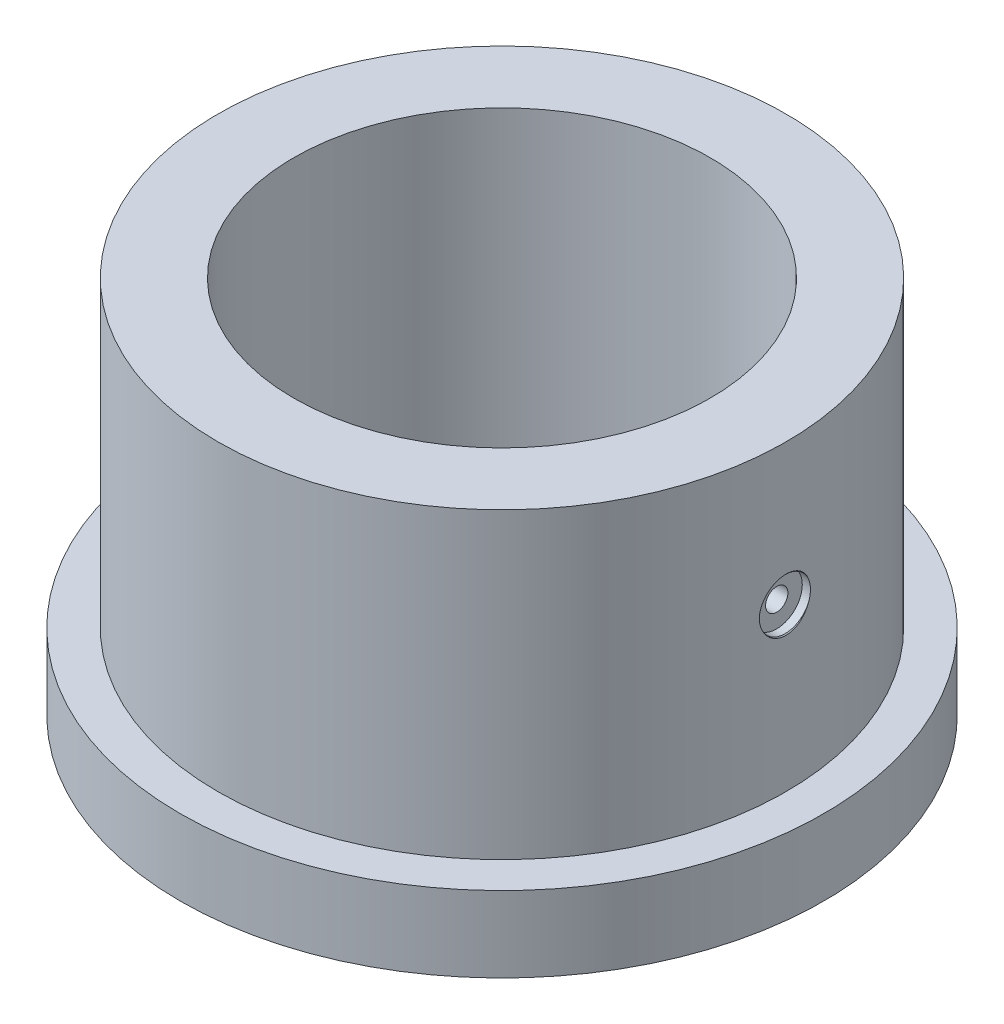
ISO-10303-21;
HEADER;
FILE_DESCRIPTION(('STEP AP214'),'2;1');
FILE_NAME('part.step','',(''),(''),'','','');
FILE_SCHEMA(('AUTOMOTIVE_DESIGN { 1 0 10303 214 1 1 1 1 }'));
ENDSEC;
DATA;
#1=APPLICATION_CONTEXT('core data for automotive mechanical design processes');
#2=APPLICATION_PROTOCOL_DEFINITION('international standard','automotive_design',2000,#1);
#3=PRODUCT_CONTEXT('',#1,'mechanical');
#4=PRODUCT('Part','Part','',(#3));
#5=PRODUCT_RELATED_PRODUCT_CATEGORY('part','',(#4));
#6=PRODUCT_DEFINITION_FORMATION('','',#4);
#7=PRODUCT_DEFINITION_CONTEXT('part definition',#1,'design');
#8=PRODUCT_DEFINITION('design','',#6,#7);
#9=PRODUCT_DEFINITION_SHAPE('','',#8);
#10=(LENGTH_UNIT() NAMED_UNIT(*) SI_UNIT(.MILLI.,.METRE.));
#11=(NAMED_UNIT(*) PLANE_ANGLE_UNIT() SI_UNIT($,.RADIAN.));
#12=(NAMED_UNIT(*) SI_UNIT($,.STERADIAN.) SOLID_ANGLE_UNIT());
#13=UNCERTAINTY_MEASURE_WITH_UNIT(LENGTH_MEASURE(1.E-05),#10,'distance_accuracy_value','');
#14=(GEOMETRIC_REPRESENTATION_CONTEXT(3) GLOBAL_UNCERTAINTY_ASSIGNED_CONTEXT((#13)) GLOBAL_UNIT_ASSIGNED_CONTEXT((#10,
#11,#12)) REPRESENTATION_CONTEXT('',''));
#15=CARTESIAN_POINT('',(0.,0.,0.));
#16=DIRECTION('',(0.,0.,1.));
#17=DIRECTION('',(1.,0.,0.));
#18=AXIS2_PLACEMENT_3D('',#15,#16,#17);
#19=CARTESIAN_POINT('',(0.,40.,0.));
#20=DIRECTION('',(0.,-1.,0.));
#21=DIRECTION('',(0.,0.,-1.));
#22=AXIS2_PLACEMENT_3D('',#19,#20,#21);
#23=CYLINDRICAL_SURFACE('',#22,37.5);
#24=CARTESIAN_POINT('',(37.3759872379215,19.9362053948256,3.04722463739168));
#25=CARTESIAN_POINT('',(37.3726797256802,20.0215978545941,3.08777002288828));
#26=CARTESIAN_POINT('',(37.3696033437569,20.108706355392,3.1247112210314));
#27=CARTESIAN_POINT('',(37.3639885897785,20.2857293180738,3.19116058974523));
#28=CARTESIAN_POINT('',(37.3614502106035,20.3756437428055,3.22066885868546));
#29=CARTESIAN_POINT('',(37.3569882165124,20.5576100002171,3.2720161805453));
#30=CARTESIAN_POINT('',(37.3550643000772,20.6496607607286,3.29385899545279));
#31=CARTESIAN_POINT('',(37.3518825815497,20.8352542157296,3.329741810013));
#32=CARTESIAN_POINT('',(37.3506247545447,20.928796854286,3.34378210149221));
#33=CARTESIAN_POINT('',(37.3479105475352,21.2108373126497,3.37403261802099));
#34=CARTESIAN_POINT('',(37.3475132070472,21.4007569982064,3.37837510730142));
#35=CARTESIAN_POINT('',(37.3496047828837,21.7784038527739,3.35516512404587));
#36=CARTESIAN_POINT('',(37.3520909126383,21.9661329617823,3.32764344491484));
#37=CARTESIAN_POINT('',(37.3582738755683,22.267192361125,3.25731457068637));
#38=CARTESIAN_POINT('',(37.361202029245,22.3827596828898,3.22370122485717));
#39=CARTESIAN_POINT('',(37.3679571317951,22.6095273088068,3.14440455619457));
#40=CARTESIAN_POINT('',(37.3717832354287,22.7207316056754,3.09873257912201));
#41=CARTESIAN_POINT('',(37.3759872379215,22.8292042152008,3.04722463739168));
#42=B_SPLINE_CURVE_WITH_KNOTS('',3,(#24,#25,#26,#27,#28,#29,#30,#31,#32,#33,#34,#35,#36,#37,#38,
#39,#40,#41),.UNSPECIFIED.,.F.,.F.,(4,2,2,2,2,2,2,2,4),(0.,0.283671136964744,0.567338519547046,
0.850866490876159,1.13438385710443,1.70138989622664,2.26784844003115,2.62838224538641,
2.98857803204161),.UNSPECIFIED.);
#43=CARTESIAN_POINT('',(37.3759872379215,19.9362053948256,3.04722463739167));
#44=VERTEX_POINT('',#43);
#45=CARTESIAN_POINT('',(37.3759872379215,22.8292042152008,3.04722463739168));
#46=VERTEX_POINT('',#45);
#47=EDGE_CURVE('E48',#44,#46,#42,.T.);
#48=ORIENTED_EDGE('',*,*,#47,.T.);
#49=CARTESIAN_POINT('',(37.3633859617138,22.4143081356666,3.19802899861885));
#50=CARTESIAN_POINT('',(37.365390995044,22.4936095597051,3.17459325336234));
#51=CARTESIAN_POINT('',(37.3676079679503,22.5720811131479,3.14844353211102));
#52=CARTESIAN_POINT('',(37.3724196410904,22.727021037142,3.09080906731293));
#53=CARTESIAN_POINT('',(37.3750143132335,22.803489556166,3.05932472048848));
#54=CARTESIAN_POINT('',(37.3833039455929,23.0296053635383,2.95690709088255));
#55=CARTESIAN_POINT('',(37.3894986098886,23.1757373727926,2.87807579593857));
#56=CARTESIAN_POINT('',(37.4041411249187,23.4851876814321,2.68176309295213));
#57=CARTESIAN_POINT('',(37.4127880966511,23.6455648286063,2.55962889714193));
#58=CARTESIAN_POINT('',(37.4302979095125,23.9425866225883,2.2893377061694));
#59=CARTESIAN_POINT('',(37.4391606779101,24.0792391425997,2.14118937695558));
#60=CARTESIAN_POINT('',(37.4557284365573,24.3199576213481,1.8281449727772));
#61=CARTESIAN_POINT('',(37.4634620451774,24.4249527268776,1.66396584245706));
#62=CARTESIAN_POINT('',(37.4771700708145,24.6044197253916,1.319598819364));
#63=CARTESIAN_POINT('',(37.4831447996911,24.6788970302792,1.13941377191774));
#64=CARTESIAN_POINT('',(37.4923687762712,24.791759972022,0.776945956685423));
#65=CARTESIAN_POINT('',(37.4957289963906,24.8316246212323,0.595126024080255));
#66=CARTESIAN_POINT('',(37.499761374976,24.8793030806965,0.227323963771679));
#67=CARTESIAN_POINT('',(37.5004342731599,24.8871257109185,0.0413429956199996));
#68=CARTESIAN_POINT('',(37.4990351551324,24.8706881410918,-0.323504494827572));
#69=CARTESIAN_POINT('',(37.497045735245,24.847393373875,-0.502415771125627));
#70=CARTESIAN_POINT('',(37.4906913288622,24.7712675994241,-0.853788494309411));
#71=CARTESIAN_POINT('',(37.4863262660142,24.7184356428679,-1.02624973370155));
#72=CARTESIAN_POINT('',(37.4756855444454,24.584899792982,-1.36054431054275));
#73=CARTESIAN_POINT('',(37.4694040388719,24.5041105022414,-1.52234325551148));
#74=CARTESIAN_POINT('',(37.4556091717827,24.317386531163,-1.83062489097532));
#75=CARTESIAN_POINT('',(37.4480957276161,24.2114501634901,-1.97710655275074));
#76=CARTESIAN_POINT('',(37.4323538747704,23.9737898059196,-2.25589363654875));
#77=CARTESIAN_POINT('',(37.4241100108507,23.8413264310076,-2.38756694531148));
#78=CARTESIAN_POINT('',(37.4079993263813,23.556927548946,-2.62795021139202));
#79=CARTESIAN_POINT('',(37.4001325874566,23.404987852254,-2.73665521464538));
#80=CARTESIAN_POINT('',(37.3869260211993,23.1153865091547,-2.91101262716051));
#81=CARTESIAN_POINT('',(37.3813877428516,22.980260225785,-2.98090772511597));
#82=CARTESIAN_POINT('',(37.3714512730723,22.7024366720605,-3.10292821633644));
#83=CARTESIAN_POINT('',(37.3670511918718,22.5597524311885,-3.1550831099275));
#84=CARTESIAN_POINT('',(37.3633859617138,22.4143081356666,-3.19802899861885));
#85=B_SPLINE_CURVE_WITH_KNOTS('',3,(#49,#50,#51,#52,#53,#54,#55,#56,#57,#58,#59,#60,#61,#62,#63,
#64,#65,#66,#67,#68,#69,#70,#71,#72,#73,#74,#75,#76,#77,#78,#79,#80,#81,#82,#83,#84),
.UNSPECIFIED.,.F.,.F.,(4,2,2,2,2,2,2,2,2,2,2,2,2,2,2,2,2,4),(0.,0.248055792045143,
0.496093144911716,0.992867325162136,1.59514478541185,2.19722199151993,2.77936406081942,
3.36140285067571,3.91713687579763,4.47271791786823,5.01145597887131,5.55021135585464,
6.09062713657916,6.63107918873403,7.1894743429262,7.74798981544084,8.20349129330153,
8.65823156810017),.UNSPECIFIED.);
#86=CARTESIAN_POINT('',(37.3759872379215,22.8292042152008,-3.04722463739168));
#87=VERTEX_POINT('',#86);
#88=EDGE_CURVE('E11',#46,#87,#85,.T.);
#89=ORIENTED_EDGE('',*,*,#88,.T.);
#90=CARTESIAN_POINT('',(37.3759872379215,22.8292042152008,-3.04722463739168));
#91=CARTESIAN_POINT('',(37.3726797256802,22.7438117554323,-3.08777002288828));
#92=CARTESIAN_POINT('',(37.3696033437569,22.6567032546343,-3.1247112210314));
#93=CARTESIAN_POINT('',(37.3639885897785,22.4796802919526,-3.19116058974523));
#94=CARTESIAN_POINT('',(37.3614502106035,22.3897658672208,-3.22066885868546));
#95=CARTESIAN_POINT('',(37.3569882165124,22.2077996098093,-3.2720161805453));
#96=CARTESIAN_POINT('',(37.3550643000772,22.1157488492978,-3.29385899545279));
#97=CARTESIAN_POINT('',(37.3518825815497,21.9301553942968,-3.329741810013));
#98=CARTESIAN_POINT('',(37.3506247545447,21.8366127557404,-3.34378210149221));
#99=CARTESIAN_POINT('',(37.3479105475352,21.5545722973767,-3.37403261802099));
#100=CARTESIAN_POINT('',(37.3475132070472,21.36465261182,-3.37837510730142));
#101=CARTESIAN_POINT('',(37.3496047828837,20.9870057572524,-3.35516512404587));
#102=CARTESIAN_POINT('',(37.3520909126383,20.799276648244,-3.32764344491484));
#103=CARTESIAN_POINT('',(37.3582738755683,20.4982172489014,-3.25731457068637));
#104=CARTESIAN_POINT('',(37.361202029245,20.3826499271366,-3.22370122485717));
#105=CARTESIAN_POINT('',(37.3679571317951,20.1558823012196,-3.14440455619457));
#106=CARTESIAN_POINT('',(37.3717832354287,20.044678004351,-3.09873257912201));
#107=CARTESIAN_POINT('',(37.3759872379215,19.9362053948256,-3.04722463739168));
#108=B_SPLINE_CURVE_WITH_KNOTS('',3,(#90,#91,#92,#93,#94,#95,#96,#97,#98,#99,#100,#101,#102,
#103,#104,#105,#106,#107),.UNSPECIFIED.,.F.,.F.,(4,2,2,2,2,2,2,2,4),(0.,0.283671136964747,
0.567338519547046,0.850866490876159,1.13438385710443,1.70138989622664,2.26784844003115,
2.62838224538641,2.98857803204161),.UNSPECIFIED.);
#109=CARTESIAN_POINT('',(37.3759872379215,19.9362053948256,-3.04722463739168));
#110=VERTEX_POINT('',#109);
#111=EDGE_CURVE('E67',#87,#110,#108,.T.);
#112=ORIENTED_EDGE('',*,*,#111,.T.);
#113=CARTESIAN_POINT('',(37.3633859617137,20.3511014743649,-3.19802899862035));
#114=CARTESIAN_POINT('',(37.3653909950438,20.2718000503263,-3.17459325336396));
#115=CARTESIAN_POINT('',(37.3676079679502,20.1933284968835,-3.14844353211276));
#116=CARTESIAN_POINT('',(37.3724196410902,20.0383885728893,-3.09080906731489));
#117=CARTESIAN_POINT('',(37.3750143132334,19.9619200538653,-3.05932472049056));
#118=CARTESIAN_POINT('',(37.3833039455927,19.7358042464928,-2.95690709088497));
#119=CARTESIAN_POINT('',(37.3894986098884,19.5896722372384,-2.87807579594121));
#120=CARTESIAN_POINT('',(37.4041411249185,19.2802219285986,-2.68176309295523));
#121=CARTESIAN_POINT('',(37.4127880966509,19.1198447814242,-2.55962889714526));
#122=CARTESIAN_POINT('',(37.4302979095123,18.8228229874417,-2.28933770617315));
#123=CARTESIAN_POINT('',(37.4391606779099,18.6861704674301,-2.14118937695953));
#124=CARTESIAN_POINT('',(37.455728436557,18.4454519886812,-1.82814497278147));
#125=CARTESIAN_POINT('',(37.4634620451773,18.3404568831514,-1.66396584246146));
#126=CARTESIAN_POINT('',(37.4771700708144,18.1609898846368,-1.31959881936862));
#127=CARTESIAN_POINT('',(37.4831447996909,18.0865125797489,-1.13941377192243));
#128=CARTESIAN_POINT('',(37.4923687762711,17.9736496380055,-0.776945956690213));
#129=CARTESIAN_POINT('',(37.4957289963905,17.933784988795,-0.595126024085072));
#130=CARTESIAN_POINT('',(37.499761374976,17.8861065293302,-0.227323963776499));
#131=CARTESIAN_POINT('',(37.5004342731599,17.878283899108,-0.0413429956247967));
#132=CARTESIAN_POINT('',(37.4990351551324,17.8947214689341,0.323504494822846));
#133=CARTESIAN_POINT('',(37.497045735245,17.9180162361507,0.502415771120948));
#134=CARTESIAN_POINT('',(37.4906913288623,17.994142010601,0.853788494304868));
#135=CARTESIAN_POINT('',(37.4863262660143,18.0469739671569,1.02624973369709));
#136=CARTESIAN_POINT('',(37.4756855444456,18.1805098170424,1.36054431053848));
#137=CARTESIAN_POINT('',(37.4694040388721,18.2612991077827,1.52234325550732));
#138=CARTESIAN_POINT('',(37.4556091717829,18.4480230788607,1.83062489097139));
#139=CARTESIAN_POINT('',(37.4480957276163,18.5539594465334,1.97710655274696));
#140=CARTESIAN_POINT('',(37.4323538747707,18.7916198041035,2.25589363654526));
#141=CARTESIAN_POINT('',(37.4241100108509,18.9240831790152,2.38756694530816));
#142=CARTESIAN_POINT('',(37.4079993263815,19.2084820610764,2.62795021138905));
#143=CARTESIAN_POINT('',(37.4001325874569,19.3604217577682,2.73665521464261));
#144=CARTESIAN_POINT('',(37.3869260211994,19.6500231008688,2.91101262715901));
#145=CARTESIAN_POINT('',(37.3813877428517,19.78514938424,2.98090772511535));
#146=CARTESIAN_POINT('',(37.3714512730723,20.0629729379676,3.10292821633719));
#147=CARTESIAN_POINT('',(37.3670511918717,20.2056571788413,3.15508310992873));
#148=CARTESIAN_POINT('',(37.3633859617137,20.3511014743649,3.19802899862035));
#149=B_SPLINE_CURVE_WITH_KNOTS('',3,(#113,#114,#115,#116,#117,#118,#119,#120,#121,#122,#123,
#124,#125,#126,#127,#128,#129,#130,#131,#132,#133,#134,#135,#136,#137,#138,#139,#140,#141,#142,
#143,#144,#145,#146,#147,#148),.UNSPECIFIED.,.F.,.F.,(4,2,2,2,2,2,2,2,2,2,2,2,2,2,2,2,2,4),(0.,
0.248055792045133,0.496093144911696,0.992867325162098,1.59514478541188,2.19722199152003,
2.77936406081964,3.36140285067605,3.91713687579808,4.47271791786878,5.0114559788719,
5.55021135585526,6.09062713657973,6.63107918873456,7.18947434292662,7.74798981544116,
8.20349129330699,8.65823156811075),.UNSPECIFIED.);
#150=EDGE_CURVE('E58',#110,#44,#149,.T.);
#151=ORIENTED_EDGE('',*,*,#150,.T.);
#152=EDGE_LOOP('',(#48,#89,#112,#151));
#153=FACE_BOUND('',#152,.T.);
#154=CARTESIAN_POINT('',(0.,40.,0.));
#155=DIRECTION('',(0.,1.,0.));
#156=DIRECTION('',(0.,0.,1.));
#157=AXIS2_PLACEMENT_3D('',#154,#155,#156);
#158=CIRCLE('',#157,37.5);
#159=CARTESIAN_POINT('',(0.,40.,37.5));
#160=VERTEX_POINT('',#159);
#161=EDGE_CURVE('E135',#160,#160,#158,.T.);
#162=ORIENTED_EDGE('',*,*,#161,.F.);
#163=EDGE_LOOP('',(#162));
#164=FACE_BOUND('',#163,.T.);
#165=CARTESIAN_POINT('',(0.,0.,0.));
#166=DIRECTION('',(0.,1.,0.));
#167=DIRECTION('',(0.,0.,1.));
#168=AXIS2_PLACEMENT_3D('',#165,#166,#167);
#169=CIRCLE('',#168,37.5);
#170=CARTESIAN_POINT('',(0.,0.,37.5));
#171=VERTEX_POINT('',#170);
#172=EDGE_CURVE('E136',#171,#171,#169,.T.);
#173=ORIENTED_EDGE('',*,*,#172,.T.);
#174=EDGE_LOOP('',(#173));
#175=FACE_BOUND('',#174,.T.);
#176=ADVANCED_FACE('F35',(#153,#164,#175),#23,.T.);
#177=CARTESIAN_POINT('',(0.,40.,0.));
#178=DIRECTION('',(0.,1.,0.));
#179=DIRECTION('',(0.,0.,1.));
#180=AXIS2_PLACEMENT_3D('',#177,#178,#179);
#181=PLANE('',#180);
#182=CARTESIAN_POINT('',(0.,40.,0.));
#183=DIRECTION('',(0.,1.,0.));
#184=DIRECTION('',(0.,0.,1.));
#185=AXIS2_PLACEMENT_3D('',#182,#183,#184);
#186=CIRCLE('',#185,27.5);
#187=CARTESIAN_POINT('',(0.,40.,27.5));
#188=VERTEX_POINT('',#187);
#189=EDGE_CURVE('E132',#188,#188,#186,.T.);
#190=ORIENTED_EDGE('',*,*,#189,.F.);
#191=EDGE_LOOP('',(#190));
#192=FACE_BOUND('',#191,.T.);
#193=ORIENTED_EDGE('',*,*,#161,.T.);
#194=EDGE_LOOP('',(#193));
#195=FACE_BOUND('',#194,.T.);
#196=ADVANCED_FACE('F119',(#192,#195),#181,.T.);
#197=CARTESIAN_POINT('',(0.,0.,0.));
#198=DIRECTION('',(0.,1.,0.));
#199=DIRECTION('',(0.,0.,1.));
#200=AXIS2_PLACEMENT_3D('',#197,#198,#199);
#201=PLANE('',#200);
#202=CARTESIAN_POINT('',(0.,0.,0.));
#203=DIRECTION('',(0.,1.,0.));
#204=DIRECTION('',(0.,0.,1.));
#205=AXIS2_PLACEMENT_3D('',#202,#203,#204);
#206=CIRCLE('',#205,42.5);
#207=CARTESIAN_POINT('',(0.,0.,42.5));
#208=VERTEX_POINT('',#207);
#209=EDGE_CURVE('E145',#208,#208,#206,.T.);
#210=ORIENTED_EDGE('',*,*,#209,.T.);
#211=EDGE_LOOP('',(#210));
#212=FACE_BOUND('',#211,.T.);
#213=ORIENTED_EDGE('',*,*,#172,.F.);
#214=EDGE_LOOP('',(#213));
#215=FACE_BOUND('',#214,.T.);
#216=ADVANCED_FACE('F116',(#212,#215),#201,.T.);
#217=CARTESIAN_POINT('',(0.,-10.,0.));
#218=DIRECTION('',(0.,1.,0.));
#219=DIRECTION('',(0.,0.,1.));
#220=AXIS2_PLACEMENT_3D('',#217,#218,#219);
#221=CYLINDRICAL_SURFACE('',#220,42.5);
#222=CARTESIAN_POINT('',(0.,-10.,0.));
#223=DIRECTION('',(0.,1.,0.));
#224=DIRECTION('',(0.,0.,1.));
#225=AXIS2_PLACEMENT_3D('',#222,#223,#224);
#226=CIRCLE('',#225,42.5);
#227=CARTESIAN_POINT('',(0.,-10.,42.5));
#228=VERTEX_POINT('',#227);
#229=EDGE_CURVE('E139',#228,#228,#226,.T.);
#230=ORIENTED_EDGE('',*,*,#229,.T.);
#231=EDGE_LOOP('',(#230));
#232=FACE_BOUND('',#231,.T.);
#233=ORIENTED_EDGE('',*,*,#209,.F.);
#234=EDGE_LOOP('',(#233));
#235=FACE_BOUND('',#234,.T.);
#236=ADVANCED_FACE('F114',(#232,#235),#221,.T.);
#237=CARTESIAN_POINT('',(0.,-10.,0.));
#238=DIRECTION('',(0.,1.,0.));
#239=DIRECTION('',(0.,0.,1.));
#240=AXIS2_PLACEMENT_3D('',#237,#238,#239);
#241=PLANE('',#240);
#242=CARTESIAN_POINT('',(0.,-10.,0.));
#243=DIRECTION('',(0.,1.,0.));
#244=DIRECTION('',(0.,0.,1.));
#245=AXIS2_PLACEMENT_3D('',#242,#243,#244);
#246=CIRCLE('',#245,27.5);
#247=CARTESIAN_POINT('',(0.,-10.,27.5));
#248=VERTEX_POINT('',#247);
#249=EDGE_CURVE('E148',#248,#248,#246,.T.);
#250=ORIENTED_EDGE('',*,*,#249,.T.);
#251=EDGE_LOOP('',(#250));
#252=FACE_BOUND('',#251,.T.);
#253=ORIENTED_EDGE('',*,*,#229,.F.);
#254=EDGE_LOOP('',(#253));
#255=FACE_BOUND('',#254,.T.);
#256=ADVANCED_FACE('F110',(#252,#255),#241,.F.);
#257=CARTESIAN_POINT('',(0.,-10.,0.));
#258=DIRECTION('',(0.,1.,0.));
#259=DIRECTION('',(0.,0.,1.));
#260=AXIS2_PLACEMENT_3D('',#257,#258,#259);
#261=CYLINDRICAL_SURFACE('',#260,27.5);
#262=CARTESIAN_POINT('',(27.460511316434,21.3827048050132,-1.4732));
#263=CARTESIAN_POINT('',(27.4605118463273,21.4653913703558,-1.47319635351639));
#264=CARTESIAN_POINT('',(27.4608887983938,21.5481363797653,-1.46621516956744));
#265=CARTESIAN_POINT('',(27.4623561183234,21.7113431852005,-1.43846516847799));
#266=CARTESIAN_POINT('',(27.4634473240658,21.7918021837372,-1.41768015787572));
#267=CARTESIAN_POINT('',(27.4662191937071,21.9480491712593,-1.36291982244018));
#268=CARTESIAN_POINT('',(27.4678995542702,22.0238395403999,-1.32895128439809));
#269=CARTESIAN_POINT('',(27.4716600089039,22.1686222588713,-1.24879870522214));
#270=CARTESIAN_POINT('',(27.4737400093313,22.23761619502,-1.20261752479443));
#271=CARTESIAN_POINT('',(27.478068074552,22.3669466623787,-1.09929218211596));
#272=CARTESIAN_POINT('',(27.4803163055743,22.4272744540589,-1.04213708683566));
#273=CARTESIAN_POINT('',(27.4847259412248,22.5374855479172,-0.918508422544588));
#274=CARTESIAN_POINT('',(27.4868873422856,22.5873684213317,-0.85203447118193));
#275=CARTESIAN_POINT('',(27.4908810866081,22.6752985623659,-0.711608253942979));
#276=CARTESIAN_POINT('',(27.4927132369851,22.7133389017771,-0.63765164389894));
#277=CARTESIAN_POINT('',(27.4958403220081,22.7764597166002,-0.484390018063075));
#278=CARTESIAN_POINT('',(27.4971352611624,22.8015403007699,-0.405085047160792));
#279=CARTESIAN_POINT('',(27.4990408800135,22.83800624141,-0.243459370514549));
#280=CARTESIAN_POINT('',(27.4996522217712,22.8494048495949,-0.16114166254762));
#281=CARTESIAN_POINT('',(27.5001239790235,22.858224177376,0.0042408577179743));
#282=CARTESIAN_POINT('',(27.4999844010999,22.8556450194871,0.0873056634619704));
#283=CARTESIAN_POINT('',(27.4989706036072,22.8365930060754,0.251734736837671));
#284=CARTESIAN_POINT('',(27.4980971380982,22.820134411433,0.333100662136913));
#285=CARTESIAN_POINT('',(27.4957148066125,22.7738128365517,0.491913150264885));
#286=CARTESIAN_POINT('',(27.4942059376827,22.7439497940118,0.569359694875303));
#287=CARTESIAN_POINT('',(27.4907214449114,22.6716507945694,0.718180882760949));
#288=CARTESIAN_POINT('',(27.488745580301,22.6292083492287,0.789552368014942));
#289=CARTESIAN_POINT('',(27.4845495710486,22.5329600625792,0.924162954343171));
#290=CARTESIAN_POINT('',(27.4823294244121,22.4791541284903,0.987401989011128));
#291=CARTESIAN_POINT('',(27.4778915381828,22.3616256176395,1.1040357386749));
#292=CARTESIAN_POINT('',(27.4756738051186,22.2978906669343,1.15741798584266));
#293=CARTESIAN_POINT('',(27.4714935675632,22.1623567626807,1.25272676609486));
#294=CARTESIAN_POINT('',(27.4695310631478,22.090557806741,1.29465329578229));
#295=CARTESIAN_POINT('',(27.4660828120858,21.9409263699147,1.36585946527306));
#296=CARTESIAN_POINT('',(27.4645970836719,21.8630936584302,1.39513862143814));
#297=CARTESIAN_POINT('',(27.4622706158785,21.703607555106,1.44021051511399));
#298=CARTESIAN_POINT('',(27.4614298709301,21.6219541962615,1.45600336906984));
#299=CARTESIAN_POINT('',(27.4604892154297,21.4572532838582,1.47363890725496));
#300=CARTESIAN_POINT('',(27.4603883855302,21.374207588987,1.47549890318116));
#301=CARTESIAN_POINT('',(27.4609365302806,21.2089838633143,1.46526111813911));
#302=CARTESIAN_POINT('',(27.4615855020777,21.1268058292126,1.45316339027962));
#303=CARTESIAN_POINT('',(27.4635592684138,20.9656988714196,1.41536793169163));
#304=CARTESIAN_POINT('',(27.4648836685379,20.8867680805441,1.3896781376944));
#305=CARTESIAN_POINT('',(27.4680586903732,20.7343386156004,1.32543581963465));
#306=CARTESIAN_POINT('',(27.4699093155854,20.660839977678,1.286883209992));
#307=CARTESIAN_POINT('',(27.4739304495026,20.5212815627832,1.19796524724613));
#308=CARTESIAN_POINT('',(27.4761012721163,20.4552291992433,1.14758827302244));
#309=CARTESIAN_POINT('',(27.4805170350344,20.332512917873,1.03646855945424));
#310=CARTESIAN_POINT('',(27.4827619758787,20.2758490684442,0.975725744594194));
#311=CARTESIAN_POINT('',(27.4870756494499,20.1734600398781,0.845524219826992));
#312=CARTESIAN_POINT('',(27.4891442005805,20.127746048309,0.776056705311614));
#313=CARTESIAN_POINT('',(27.4928693786709,20.0486308878051,0.630422151058256));
#314=CARTESIAN_POINT('',(27.4945260076214,20.015229659368,0.554255143698341));
#315=CARTESIAN_POINT('',(27.4972397809122,19.9617076994581,0.397425194609855));
#316=CARTESIAN_POINT('',(27.4982972473699,19.9415798310998,0.316764694308979));
#317=CARTESIAN_POINT('',(27.4996948076916,19.9151525798751,0.153203295792216));
#318=CARTESIAN_POINT('',(27.5000349063944,19.9088531037337,0.070302412691943));
#319=CARTESIAN_POINT('',(27.4999594240823,19.9102623402092,-0.0952755477067628));
#320=CARTESIAN_POINT('',(27.499544789142,19.9179535152399,-0.177952775273233));
#321=CARTESIAN_POINT('',(27.4980083721716,19.9470894470655,-0.340840313335516));
#322=CARTESIAN_POINT('',(27.4968865888303,19.9685342293639,-0.421050619256576));
#323=CARTESIAN_POINT('',(27.4940620504372,20.0245649351096,-0.576730796425073));
#324=CARTESIAN_POINT('',(27.4923592929987,20.059150912544,-0.65220064819612));
#325=CARTESIAN_POINT('',(27.4885642206232,20.1404794069801,-0.796263915552805));
#326=CARTESIAN_POINT('',(27.4864719171559,20.187221566076,-0.864857533508109));
#327=CARTESIAN_POINT('',(27.4821301760042,20.2915990948211,-0.99330929091639));
#328=CARTESIAN_POINT('',(27.4798805615384,20.3492468480103,-1.05315736132459));
#329=CARTESIAN_POINT('',(27.4754790197072,20.4737880147431,-1.16234558406727));
#330=CARTESIAN_POINT('',(27.4733271164783,20.5406836963585,-1.21168315111529));
#331=CARTESIAN_POINT('',(27.4693621019052,20.6818806504632,-1.29847649863748));
#332=CARTESIAN_POINT('',(27.4675493428727,20.75618950246,-1.33591995106829));
#333=CARTESIAN_POINT('',(27.4644725198306,20.9099936173621,-1.3977541535564));
#334=CARTESIAN_POINT('',(27.4632078094803,20.9894826430007,-1.42216028711509));
#335=CARTESIAN_POINT('',(27.4617038225063,21.1216704489922,-1.45084057691368));
#336=CARTESIAN_POINT('',(27.4612586117882,21.1735134651263,-1.45921461952496));
#337=CARTESIAN_POINT('',(27.4606621907879,21.277798079754,-1.47039548515988));
#338=CARTESIAN_POINT('',(27.4605109802135,21.3302396776529,-1.47320231371597));
#339=CARTESIAN_POINT('',(27.460511316434,21.3827048050132,-1.4732));
#340=B_SPLINE_CURVE_WITH_KNOTS('',3,(#262,#263,#264,#265,#266,#267,#268,#269,#270,#271,#272,
#273,#274,#275,#276,#277,#278,#279,#280,#281,#282,#283,#284,#285,#286,#287,#288,#289,#290,#291,
#292,#293,#294,#295,#296,#297,#298,#299,#300,#301,#302,#303,#304,#305,#306,#307,#308,#309,#310,
#311,#312,#313,#314,#315,#316,#317,#318,#319,#320,#321,#322,#323,#324,#325,#326,#327,#328,#329,
#330,#331,#332,#333,#334,#335,#336,#337,#338,#339),.UNSPECIFIED.,.T.,.F.,(4,2,2,2,2,2,2,2,2,2,2,
2,2,2,2,2,2,2,2,2,2,2,2,2,2,2,2,2,2,2,2,2,2,2,2,2,2,2,4),(0.,0.247868174857564,
0.496027642178735,0.744059527765207,0.992033365404631,1.2402555470876,1.48848791628844,
1.73686523653635,1.985240472378,2.23337494910274,2.48150725093683,2.72938491133497,
2.9772637238278,3.22527061503001,3.47327953122691,3.72160003589426,3.9699206141968,
4.21825068749061,4.46657861660066,4.71459794484482,4.96261632938521,5.21049004965727,
5.45836541913983,5.70648543104018,5.95460725058108,6.20298150728758,6.45135456368888,
6.69959396451913,6.94783169092373,7.19575846033257,7.44368568947845,7.69161393717895,
7.9395348861317,8.18773906315843,8.43600422107846,8.68452586819414,8.93275361855894,
9.09002763558756,9.24730149632402),.UNSPECIFIED.);
#341=CARTESIAN_POINT('',(27.460511316434,21.3827048050132,-1.4732));
#342=VERTEX_POINT('',#341);
#343=EDGE_CURVE('E39',#342,#342,#340,.T.);
#344=ORIENTED_EDGE('',*,*,#343,.T.);
#345=EDGE_LOOP('',(#344));
#346=FACE_BOUND('',#345,.T.);
#347=ORIENTED_EDGE('',*,*,#249,.F.);
#348=EDGE_LOOP('',(#347));
#349=FACE_BOUND('',#348,.T.);
#350=ORIENTED_EDGE('',*,*,#189,.T.);
#351=EDGE_LOOP('',(#350));
#352=FACE_BOUND('',#351,.T.);
#353=ADVANCED_FACE('F105',(#346,#349,#352),#261,.F.);
#354=CARTESIAN_POINT('',(38.,21.3827048050132,0.));
#355=DIRECTION('',(1.,0.,0.));
#356=DIRECTION('',(0.,0.,-1.));
#357=AXIS2_PLACEMENT_3D('',#354,#355,#356);
#358=CYLINDRICAL_SURFACE('',#357,1.4732);
#359=CARTESIAN_POINT('',(36.2728,21.3827048050132,0.));
#360=DIRECTION('',(1.,0.,0.));
#361=DIRECTION('',(0.,0.,-1.));
#362=AXIS2_PLACEMENT_3D('',#359,#360,#361);
#363=CIRCLE('',#362,1.4732);
#364=CARTESIAN_POINT('',(36.2728,21.3827048050132,-1.4732));
#365=VERTEX_POINT('',#364);
#366=EDGE_CURVE('E154',#365,#365,#363,.T.);
#367=ORIENTED_EDGE('',*,*,#366,.T.);
#368=EDGE_LOOP('',(#367));
#369=FACE_BOUND('',#368,.T.);
#370=ORIENTED_EDGE('',*,*,#343,.F.);
#371=EDGE_LOOP('',(#370));
#372=FACE_BOUND('',#371,.T.);
#373=ADVANCED_FACE('F95',(#369,#372),#358,.F.);
#374=CARTESIAN_POINT('',(38.,21.3827048050132,0.));
#375=DIRECTION('',(1.,0.,0.));
#376=DIRECTION('',(0.,0.,-1.));
#377=AXIS2_PLACEMENT_3D('',#374,#375,#376);
#378=CYLINDRICAL_SURFACE('',#377,3.37312);
#379=CARTESIAN_POINT('',(36.2728,21.3827048050132,0.));
#380=DIRECTION('',(1.,0.,0.));
#381=DIRECTION('',(0.,0.,-1.));
#382=AXIS2_PLACEMENT_3D('',#379,#380,#381);
#383=CIRCLE('',#382,3.37312);
#384=CARTESIAN_POINT('',(36.2728,21.3827048050132,-3.37312));
#385=VERTEX_POINT('',#384);
#386=EDGE_CURVE('E76',#385,#385,#383,.T.);
#387=ORIENTED_EDGE('',*,*,#386,.F.);
#388=EDGE_LOOP('',(#387));
#389=FACE_BOUND('',#388,.T.);
#390=CARTESIAN_POINT('',(37.3759872379215,21.3827048050132,0.));
#391=DIRECTION('',(1.,0.,0.));
#392=DIRECTION('',(0.,0.,-1.));
#393=AXIS2_PLACEMENT_3D('',#390,#391,#392);
#394=CIRCLE('',#393,3.37312);
#395=EDGE_CURVE('E54',#44,#110,#394,.T.);
#396=ORIENTED_EDGE('',*,*,#395,.T.);
#397=ORIENTED_EDGE('',*,*,#111,.F.);
#398=EDGE_CURVE('E70',#87,#46,#394,.T.);
#399=ORIENTED_EDGE('',*,*,#398,.T.);
#400=ORIENTED_EDGE('',*,*,#47,.F.);
#401=EDGE_LOOP('',(#396,#397,#399,#400));
#402=FACE_BOUND('',#401,.T.);
#403=ADVANCED_FACE('F69',(#389,#402),#378,.F.);
#404=CARTESIAN_POINT('',(38.,21.3827048050132,0.));
#405=DIRECTION('',(1.,0.,0.));
#406=DIRECTION('',(0.,0.,-1.));
#407=AXIS2_PLACEMENT_3D('',#404,#405,#406);
#408=CONICAL_SURFACE('',#407,4.00812,0.794124809657415);
#409=ORIENTED_EDGE('',*,*,#398,.F.);
#410=ORIENTED_EDGE('',*,*,#88,.F.);
#411=EDGE_LOOP('',(#409,#410));
#412=FACE_BOUND('',#411,.T.);
#413=ADVANCED_FACE('F75',(#412),#408,.F.);
#414=ORIENTED_EDGE('',*,*,#395,.F.);
#415=ORIENTED_EDGE('',*,*,#150,.F.);
#416=EDGE_LOOP('',(#414,#415));
#417=FACE_BOUND('',#416,.T.);
#418=ADVANCED_FACE('F101',(#417),#408,.F.);
#419=CARTESIAN_POINT('',(36.2728,22.8559048050132,0.));
#420=DIRECTION('',(-1.,0.,0.));
#421=DIRECTION('',(0.,0.,1.));
#422=AXIS2_PLACEMENT_3D('',#419,#420,#421);
#423=PLANE('',#422);
#424=ORIENTED_EDGE('',*,*,#366,.F.);
#425=EDGE_LOOP('',(#424));
#426=FACE_BOUND('',#425,.T.);
#427=ORIENTED_EDGE('',*,*,#386,.T.);
#428=EDGE_LOOP('',(#427));
#429=FACE_BOUND('',#428,.T.);
#430=ADVANCED_FACE('F98',(#426,#429),#423,.F.);
#431=CLOSED_SHELL('',(#176,#196,#216,#236,#256,#353,#373,#403,#413,#418,#430));
#432=MANIFOLD_SOLID_BREP('B2',#431);
#433=ADVANCED_BREP_SHAPE_REPRESENTATION('',(#18,#432),#14);
#434=SHAPE_DEFINITION_REPRESENTATION(#9,#433);
ENDSEC;
END-ISO-10303-21;
